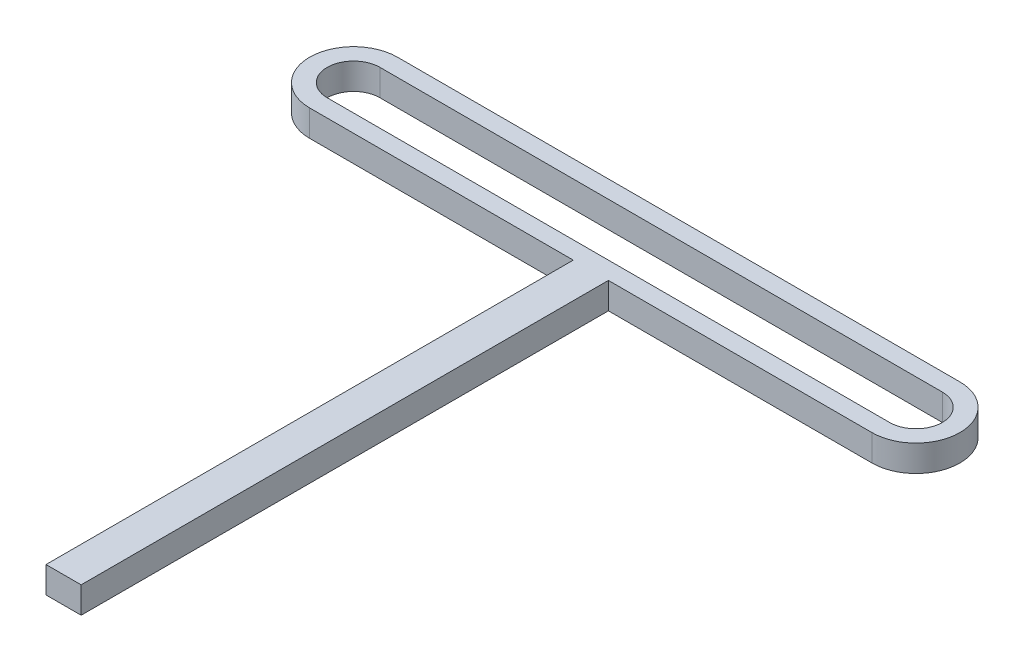
ISO-10303-21;
HEADER;
FILE_DESCRIPTION(('STEP AP214'),'2;1');
FILE_NAME('part.step','',(''),(''),'','','');
FILE_SCHEMA(('AUTOMOTIVE_DESIGN { 1 0 10303 214 1 1 1 1 }'));
ENDSEC;
DATA;
#1=APPLICATION_CONTEXT('core data for automotive mechanical design processes');
#2=APPLICATION_PROTOCOL_DEFINITION('international standard','automotive_design',2000,#1);
#3=PRODUCT_CONTEXT('',#1,'mechanical');
#4=PRODUCT('Part','Part','',(#3));
#5=PRODUCT_RELATED_PRODUCT_CATEGORY('part','',(#4));
#6=PRODUCT_DEFINITION_FORMATION('','',#4);
#7=PRODUCT_DEFINITION_CONTEXT('part definition',#1,'design');
#8=PRODUCT_DEFINITION('design','',#6,#7);
#9=PRODUCT_DEFINITION_SHAPE('','',#8);
#10=(LENGTH_UNIT() NAMED_UNIT(*) SI_UNIT(.MILLI.,.METRE.));
#11=(NAMED_UNIT(*) PLANE_ANGLE_UNIT() SI_UNIT($,.RADIAN.));
#12=(NAMED_UNIT(*) SI_UNIT($,.STERADIAN.) SOLID_ANGLE_UNIT());
#13=UNCERTAINTY_MEASURE_WITH_UNIT(LENGTH_MEASURE(1.E-05),#10,'distance_accuracy_value','');
#14=(GEOMETRIC_REPRESENTATION_CONTEXT(3) GLOBAL_UNCERTAINTY_ASSIGNED_CONTEXT((#13)) GLOBAL_UNIT_ASSIGNED_CONTEXT((#10,
#11,#12)) REPRESENTATION_CONTEXT('',''));
#15=CARTESIAN_POINT('',(0.,0.,0.));
#16=DIRECTION('',(0.,0.,1.));
#17=DIRECTION('',(1.,0.,0.));
#18=AXIS2_PLACEMENT_3D('',#15,#16,#17);
#19=CARTESIAN_POINT('',(0.,3.,5.));
#20=DIRECTION('',(0.,0.,-1.));
#21=DIRECTION('',(-1.,0.,0.));
#22=AXIS2_PLACEMENT_3D('',#19,#20,#21);
#23=PLANE('',#22);
#24=DIRECTION('',(0.,1.,0.));
#25=VECTOR('',#24,1.);
#26=CARTESIAN_POINT('',(2.,3.,5.));
#27=LINE('',#26,#25);
#28=CARTESIAN_POINT('',(2.,0.,5.));
#29=VERTEX_POINT('',#28);
#30=CARTESIAN_POINT('',(2.,3.,5.));
#31=VERTEX_POINT('',#30);
#32=EDGE_CURVE('E12',#29,#31,#27,.T.);
#33=ORIENTED_EDGE('',*,*,#32,.F.);
#34=DIRECTION('',(1.,0.,0.));
#35=VECTOR('',#34,1.);
#36=CARTESIAN_POINT('',(0.,0.,5.));
#37=LINE('',#36,#35);
#38=CARTESIAN_POINT('',(32.,0.,5.));
#39=VERTEX_POINT('',#38);
#40=EDGE_CURVE('E183',#29,#39,#37,.T.);
#41=ORIENTED_EDGE('',*,*,#40,.T.);
#42=DIRECTION('',(0.,-1.,0.));
#43=VECTOR('',#42,1.);
#44=CARTESIAN_POINT('',(32.,3.,5.));
#45=LINE('',#44,#43);
#46=CARTESIAN_POINT('',(32.,3.,5.));
#47=VERTEX_POINT('',#46);
#48=EDGE_CURVE('E168',#47,#39,#45,.T.);
#49=ORIENTED_EDGE('',*,*,#48,.F.);
#50=DIRECTION('',(1.,0.,0.));
#51=VECTOR('',#50,1.);
#52=CARTESIAN_POINT('',(0.,3.,5.));
#53=LINE('',#52,#51);
#54=EDGE_CURVE('E214',#31,#47,#53,.T.);
#55=ORIENTED_EDGE('',*,*,#54,.F.);
#56=EDGE_LOOP('',(#33,#41,#49,#55));
#57=FACE_BOUND('',#56,.T.);
#58=ADVANCED_FACE('F65',(#57),#23,.F.);
#59=CARTESIAN_POINT('',(0.,3.,-4.99999999999999));
#60=DIRECTION('',(0.,0.,-1.));
#61=DIRECTION('',(-1.,0.,0.));
#62=AXIS2_PLACEMENT_3D('',#59,#60,#61);
#63=PLANE('',#62);
#64=DIRECTION('',(1.,0.,0.));
#65=VECTOR('',#64,1.);
#66=CARTESIAN_POINT('',(0.,0.,-4.99999999999999));
#67=LINE('',#66,#65);
#68=CARTESIAN_POINT('',(-32.,0.,-4.99999999999999));
#69=VERTEX_POINT('',#68);
#70=CARTESIAN_POINT('',(32.,0.,-4.99999999999999));
#71=VERTEX_POINT('',#70);
#72=EDGE_CURVE('E188',#69,#71,#67,.T.);
#73=ORIENTED_EDGE('',*,*,#72,.F.);
#74=DIRECTION('',(0.,-1.,0.));
#75=VECTOR('',#74,1.);
#76=CARTESIAN_POINT('',(-32.,3.,-4.99999999999999));
#77=LINE('',#76,#75);
#78=CARTESIAN_POINT('',(-32.,3.,-4.99999999999999));
#79=VERTEX_POINT('',#78);
#80=EDGE_CURVE('E142',#79,#69,#77,.T.);
#81=ORIENTED_EDGE('',*,*,#80,.F.);
#82=DIRECTION('',(1.,0.,0.));
#83=VECTOR('',#82,1.);
#84=CARTESIAN_POINT('',(0.,3.,-4.99999999999999));
#85=LINE('',#84,#83);
#86=CARTESIAN_POINT('',(32.,3.,-4.99999999999999));
#87=VERTEX_POINT('',#86);
#88=EDGE_CURVE('E219',#79,#87,#85,.T.);
#89=ORIENTED_EDGE('',*,*,#88,.T.);
#90=DIRECTION('',(0.,-1.,0.));
#91=VECTOR('',#90,1.);
#92=CARTESIAN_POINT('',(32.,3.,-4.99999999999999));
#93=LINE('',#92,#91);
#94=EDGE_CURVE('E147',#87,#71,#93,.T.);
#95=ORIENTED_EDGE('',*,*,#94,.T.);
#96=EDGE_LOOP('',(#73,#81,#89,#95));
#97=FACE_BOUND('',#96,.T.);
#98=ADVANCED_FACE('F327',(#97),#63,.T.);
#99=CARTESIAN_POINT('',(-32.,3.,0.));
#100=DIRECTION('',(0.,-1.,0.));
#101=DIRECTION('',(0.,0.,-1.));
#102=AXIS2_PLACEMENT_3D('',#99,#100,#101);
#103=CYLINDRICAL_SURFACE('',#102,4.99999999999999);
#104=CARTESIAN_POINT('',(-32.,0.,0.));
#105=DIRECTION('',(0.,1.,0.));
#106=DIRECTION('',(0.,0.,1.));
#107=AXIS2_PLACEMENT_3D('',#104,#105,#106);
#108=CIRCLE('',#107,4.99999999999999);
#109=CARTESIAN_POINT('',(-32.,0.,5.));
#110=VERTEX_POINT('',#109);
#111=EDGE_CURVE('E184',#69,#110,#108,.T.);
#112=ORIENTED_EDGE('',*,*,#111,.T.);
#113=DIRECTION('',(0.,-1.,0.));
#114=VECTOR('',#113,1.);
#115=CARTESIAN_POINT('',(-32.,3.,5.));
#116=LINE('',#115,#114);
#117=CARTESIAN_POINT('',(-32.,3.,5.));
#118=VERTEX_POINT('',#117);
#119=EDGE_CURVE('E164',#118,#110,#116,.T.);
#120=ORIENTED_EDGE('',*,*,#119,.F.);
#121=CARTESIAN_POINT('',(-32.,3.,0.));
#122=DIRECTION('',(0.,1.,0.));
#123=DIRECTION('',(0.,0.,1.));
#124=AXIS2_PLACEMENT_3D('',#121,#122,#123);
#125=CIRCLE('',#124,4.99999999999999);
#126=EDGE_CURVE('E215',#79,#118,#125,.T.);
#127=ORIENTED_EDGE('',*,*,#126,.F.);
#128=ORIENTED_EDGE('',*,*,#80,.T.);
#129=EDGE_LOOP('',(#112,#120,#127,#128));
#130=FACE_BOUND('',#129,.T.);
#131=ADVANCED_FACE('F333',(#130),#103,.T.);
#132=CARTESIAN_POINT('',(-2.,0.,5.));
#133=VERTEX_POINT('',#132);
#134=EDGE_CURVE('E180',#110,#133,#37,.T.);
#135=ORIENTED_EDGE('',*,*,#134,.T.);
#136=DIRECTION('',(0.,1.,0.));
#137=VECTOR('',#136,1.);
#138=CARTESIAN_POINT('',(-2.,3.,5.));
#139=LINE('',#138,#137);
#140=CARTESIAN_POINT('',(-2.,3.,5.));
#141=VERTEX_POINT('',#140);
#142=EDGE_CURVE('E76',#133,#141,#139,.T.);
#143=ORIENTED_EDGE('',*,*,#142,.T.);
#144=EDGE_CURVE('E210',#118,#141,#53,.T.);
#145=ORIENTED_EDGE('',*,*,#144,.F.);
#146=ORIENTED_EDGE('',*,*,#119,.T.);
#147=EDGE_LOOP('',(#135,#143,#145,#146));
#148=FACE_BOUND('',#147,.T.);
#149=ADVANCED_FACE('F329',(#148),#23,.F.);
#150=CARTESIAN_POINT('',(32.,3.,0.));
#151=DIRECTION('',(0.,-1.,0.));
#152=DIRECTION('',(0.,0.,-1.));
#153=AXIS2_PLACEMENT_3D('',#150,#151,#152);
#154=CYLINDRICAL_SURFACE('',#153,2.99999999999999);
#155=CARTESIAN_POINT('',(32.,0.,0.));
#156=DIRECTION('',(0.,1.,0.));
#157=DIRECTION('',(0.,0.,1.));
#158=AXIS2_PLACEMENT_3D('',#155,#156,#157);
#159=CIRCLE('',#158,2.99999999999999);
#160=CARTESIAN_POINT('',(32.,0.,2.99999999999998));
#161=VERTEX_POINT('',#160);
#162=CARTESIAN_POINT('',(32.,0.,-3.));
#163=VERTEX_POINT('',#162);
#164=EDGE_CURVE('E203',#161,#163,#159,.T.);
#165=ORIENTED_EDGE('',*,*,#164,.F.);
#166=DIRECTION('',(0.,-1.,0.));
#167=VECTOR('',#166,1.);
#168=CARTESIAN_POINT('',(32.,3.,2.99999999999998));
#169=LINE('',#168,#167);
#170=CARTESIAN_POINT('',(32.,3.,2.99999999999998));
#171=VERTEX_POINT('',#170);
#172=EDGE_CURVE('E143',#171,#161,#169,.T.);
#173=ORIENTED_EDGE('',*,*,#172,.F.);
#174=CARTESIAN_POINT('',(32.,3.,0.));
#175=DIRECTION('',(0.,1.,0.));
#176=DIRECTION('',(0.,0.,1.));
#177=AXIS2_PLACEMENT_3D('',#174,#175,#176);
#178=CIRCLE('',#177,2.99999999999999);
#179=CARTESIAN_POINT('',(32.,3.,-3.));
#180=VERTEX_POINT('',#179);
#181=EDGE_CURVE('E179',#171,#180,#178,.T.);
#182=ORIENTED_EDGE('',*,*,#181,.T.);
#183=DIRECTION('',(0.,-1.,0.));
#184=VECTOR('',#183,1.);
#185=CARTESIAN_POINT('',(32.,3.,-3.));
#186=LINE('',#185,#184);
#187=EDGE_CURVE('E156',#180,#163,#186,.T.);
#188=ORIENTED_EDGE('',*,*,#187,.T.);
#189=EDGE_LOOP('',(#165,#173,#182,#188));
#190=FACE_BOUND('',#189,.T.);
#191=ADVANCED_FACE('F242',(#190),#154,.F.);
#192=CARTESIAN_POINT('',(0.,3.,2.99999999999998));
#193=DIRECTION('',(0.,0.,-1.));
#194=DIRECTION('',(-1.,0.,0.));
#195=AXIS2_PLACEMENT_3D('',#192,#193,#194);
#196=PLANE('',#195);
#197=DIRECTION('',(1.,0.,0.));
#198=VECTOR('',#197,1.);
#199=CARTESIAN_POINT('',(0.,0.,2.99999999999998));
#200=LINE('',#199,#198);
#201=CARTESIAN_POINT('',(-32.,0.,2.99999999999999));
#202=VERTEX_POINT('',#201);
#203=EDGE_CURVE('E199',#202,#161,#200,.T.);
#204=ORIENTED_EDGE('',*,*,#203,.F.);
#205=DIRECTION('',(0.,-1.,0.));
#206=VECTOR('',#205,1.);
#207=CARTESIAN_POINT('',(-32.,3.,2.99999999999999));
#208=LINE('',#207,#206);
#209=CARTESIAN_POINT('',(-32.,3.,2.99999999999999));
#210=VERTEX_POINT('',#209);
#211=EDGE_CURVE('E148',#210,#202,#208,.T.);
#212=ORIENTED_EDGE('',*,*,#211,.F.);
#213=DIRECTION('',(1.,0.,0.));
#214=VECTOR('',#213,1.);
#215=CARTESIAN_POINT('',(0.,3.,2.99999999999998));
#216=LINE('',#215,#214);
#217=EDGE_CURVE('E231',#210,#171,#216,.T.);
#218=ORIENTED_EDGE('',*,*,#217,.T.);
#219=ORIENTED_EDGE('',*,*,#172,.T.);
#220=EDGE_LOOP('',(#204,#212,#218,#219));
#221=FACE_BOUND('',#220,.T.);
#222=ADVANCED_FACE('F261',(#221),#196,.T.);
#223=CARTESIAN_POINT('',(-32.,3.,0.));
#224=DIRECTION('',(0.,-1.,0.));
#225=DIRECTION('',(0.,0.,-1.));
#226=AXIS2_PLACEMENT_3D('',#223,#224,#225);
#227=CYLINDRICAL_SURFACE('',#226,2.99999999999999);
#228=CARTESIAN_POINT('',(-32.,0.,0.));
#229=DIRECTION('',(0.,1.,0.));
#230=DIRECTION('',(0.,0.,1.));
#231=AXIS2_PLACEMENT_3D('',#228,#229,#230);
#232=CIRCLE('',#231,2.99999999999999);
#233=CARTESIAN_POINT('',(-32.,0.,-2.99999999999999));
#234=VERTEX_POINT('',#233);
#235=EDGE_CURVE('E195',#234,#202,#232,.T.);
#236=ORIENTED_EDGE('',*,*,#235,.F.);
#237=DIRECTION('',(0.,-1.,0.));
#238=VECTOR('',#237,1.);
#239=CARTESIAN_POINT('',(-32.,3.,-2.99999999999999));
#240=LINE('',#239,#238);
#241=CARTESIAN_POINT('',(-32.,3.,-2.99999999999999));
#242=VERTEX_POINT('',#241);
#243=EDGE_CURVE('E152',#242,#234,#240,.T.);
#244=ORIENTED_EDGE('',*,*,#243,.F.);
#245=CARTESIAN_POINT('',(-32.,3.,0.));
#246=DIRECTION('',(0.,1.,0.));
#247=DIRECTION('',(0.,0.,1.));
#248=AXIS2_PLACEMENT_3D('',#245,#246,#247);
#249=CIRCLE('',#248,2.99999999999999);
#250=EDGE_CURVE('E227',#242,#210,#249,.T.);
#251=ORIENTED_EDGE('',*,*,#250,.T.);
#252=ORIENTED_EDGE('',*,*,#211,.T.);
#253=EDGE_LOOP('',(#236,#244,#251,#252));
#254=FACE_BOUND('',#253,.T.);
#255=ADVANCED_FACE('F266',(#254),#227,.F.);
#256=CARTESIAN_POINT('',(0.,3.,-2.99999999999999));
#257=DIRECTION('',(0.,0.,-1.));
#258=DIRECTION('',(-1.,0.,0.));
#259=AXIS2_PLACEMENT_3D('',#256,#257,#258);
#260=PLANE('',#259);
#261=DIRECTION('',(1.,0.,0.));
#262=VECTOR('',#261,1.);
#263=CARTESIAN_POINT('',(0.,0.,-2.99999999999999));
#264=LINE('',#263,#262);
#265=EDGE_CURVE('E191',#234,#163,#264,.T.);
#266=ORIENTED_EDGE('',*,*,#265,.T.);
#267=ORIENTED_EDGE('',*,*,#187,.F.);
#268=DIRECTION('',(1.,0.,0.));
#269=VECTOR('',#268,1.);
#270=CARTESIAN_POINT('',(0.,3.,-2.99999999999999));
#271=LINE('',#270,#269);
#272=EDGE_CURVE('E223',#242,#180,#271,.T.);
#273=ORIENTED_EDGE('',*,*,#272,.F.);
#274=ORIENTED_EDGE('',*,*,#243,.T.);
#275=EDGE_LOOP('',(#266,#267,#273,#274));
#276=FACE_BOUND('',#275,.T.);
#277=ADVANCED_FACE('F308',(#276),#260,.F.);
#278=CARTESIAN_POINT('',(32.,3.,0.));
#279=DIRECTION('',(0.,-1.,0.));
#280=DIRECTION('',(0.,0.,-1.));
#281=AXIS2_PLACEMENT_3D('',#278,#279,#280);
#282=CYLINDRICAL_SURFACE('',#281,4.99999999999999);
#283=CARTESIAN_POINT('',(32.,0.,0.));
#284=DIRECTION('',(0.,1.,0.));
#285=DIRECTION('',(0.,0.,1.));
#286=AXIS2_PLACEMENT_3D('',#283,#284,#285);
#287=CIRCLE('',#286,4.99999999999999);
#288=EDGE_CURVE('E175',#39,#71,#287,.T.);
#289=ORIENTED_EDGE('',*,*,#288,.T.);
#290=ORIENTED_EDGE('',*,*,#94,.F.);
#291=CARTESIAN_POINT('',(32.,3.,0.));
#292=DIRECTION('',(0.,1.,0.));
#293=DIRECTION('',(0.,0.,1.));
#294=AXIS2_PLACEMENT_3D('',#291,#292,#293);
#295=CIRCLE('',#294,4.99999999999999);
#296=EDGE_CURVE('E160',#47,#87,#295,.T.);
#297=ORIENTED_EDGE('',*,*,#296,.F.);
#298=ORIENTED_EDGE('',*,*,#48,.T.);
#299=EDGE_LOOP('',(#289,#290,#297,#298));
#300=FACE_BOUND('',#299,.T.);
#301=ADVANCED_FACE('F297',(#300),#282,.T.);
#302=CARTESIAN_POINT('',(0.,3.,0.));
#303=DIRECTION('',(0.,1.,0.));
#304=DIRECTION('',(0.,0.,1.));
#305=AXIS2_PLACEMENT_3D('',#302,#303,#304);
#306=PLANE('',#305);
#307=ORIENTED_EDGE('',*,*,#181,.F.);
#308=ORIENTED_EDGE('',*,*,#217,.F.);
#309=ORIENTED_EDGE('',*,*,#250,.F.);
#310=ORIENTED_EDGE('',*,*,#272,.T.);
#311=EDGE_LOOP('',(#307,#308,#309,#310));
#312=FACE_BOUND('',#311,.T.);
#313=ORIENTED_EDGE('',*,*,#88,.F.);
#314=ORIENTED_EDGE('',*,*,#126,.T.);
#315=ORIENTED_EDGE('',*,*,#144,.T.);
#316=DIRECTION('',(0.,0.,-1.));
#317=VECTOR('',#316,1.);
#318=CARTESIAN_POINT('',(-1.99999999999999,3.,65.));
#319=LINE('',#318,#317);
#320=CARTESIAN_POINT('',(-1.99999999999999,3.,65.));
#321=VERTEX_POINT('',#320);
#322=EDGE_CURVE('E116',#321,#141,#319,.T.);
#323=ORIENTED_EDGE('',*,*,#322,.F.);
#324=DIRECTION('',(1.,0.,0.));
#325=VECTOR('',#324,1.);
#326=CARTESIAN_POINT('',(-1.99999999999999,3.,65.));
#327=LINE('',#326,#325);
#328=CARTESIAN_POINT('',(2.00000000000001,3.,65.));
#329=VERTEX_POINT('',#328);
#330=EDGE_CURVE('E110',#321,#329,#327,.T.);
#331=ORIENTED_EDGE('',*,*,#330,.T.);
#332=DIRECTION('',(0.,0.,-1.));
#333=VECTOR('',#332,1.);
#334=CARTESIAN_POINT('',(2.00000000000001,3.,65.));
#335=LINE('',#334,#333);
#336=EDGE_CURVE('E132',#329,#31,#335,.T.);
#337=ORIENTED_EDGE('',*,*,#336,.T.);
#338=ORIENTED_EDGE('',*,*,#54,.T.);
#339=ORIENTED_EDGE('',*,*,#296,.T.);
#340=EDGE_LOOP('',(#313,#314,#315,#323,#331,#337,#338,#339));
#341=FACE_BOUND('',#340,.T.);
#342=ADVANCED_FACE('F251',(#312,#341),#306,.T.);
#343=CARTESIAN_POINT('',(0.,0.,0.));
#344=DIRECTION('',(0.,1.,0.));
#345=DIRECTION('',(0.,0.,1.));
#346=AXIS2_PLACEMENT_3D('',#343,#344,#345);
#347=PLANE('',#346);
#348=ORIENTED_EDGE('',*,*,#164,.T.);
#349=ORIENTED_EDGE('',*,*,#265,.F.);
#350=ORIENTED_EDGE('',*,*,#235,.T.);
#351=ORIENTED_EDGE('',*,*,#203,.T.);
#352=EDGE_LOOP('',(#348,#349,#350,#351));
#353=FACE_BOUND('',#352,.T.);
#354=ORIENTED_EDGE('',*,*,#72,.T.);
#355=ORIENTED_EDGE('',*,*,#288,.F.);
#356=ORIENTED_EDGE('',*,*,#40,.F.);
#357=DIRECTION('',(0.,0.,-1.));
#358=VECTOR('',#357,1.);
#359=CARTESIAN_POINT('',(2.00000000000001,0.,65.));
#360=LINE('',#359,#358);
#361=CARTESIAN_POINT('',(2.00000000000001,0.,65.));
#362=VERTEX_POINT('',#361);
#363=EDGE_CURVE('E100',#362,#29,#360,.T.);
#364=ORIENTED_EDGE('',*,*,#363,.F.);
#365=DIRECTION('',(1.,0.,0.));
#366=VECTOR('',#365,1.);
#367=CARTESIAN_POINT('',(-1.99999999999999,0.,65.));
#368=LINE('',#367,#366);
#369=CARTESIAN_POINT('',(-1.99999999999999,0.,65.));
#370=VERTEX_POINT('',#369);
#371=EDGE_CURVE('E108',#370,#362,#368,.T.);
#372=ORIENTED_EDGE('',*,*,#371,.F.);
#373=DIRECTION('',(0.,0.,-1.));
#374=VECTOR('',#373,1.);
#375=CARTESIAN_POINT('',(-1.99999999999999,0.,65.));
#376=LINE('',#375,#374);
#377=EDGE_CURVE('E122',#370,#133,#376,.T.);
#378=ORIENTED_EDGE('',*,*,#377,.T.);
#379=ORIENTED_EDGE('',*,*,#134,.F.);
#380=ORIENTED_EDGE('',*,*,#111,.F.);
#381=EDGE_LOOP('',(#354,#355,#356,#364,#372,#378,#379,#380));
#382=FACE_BOUND('',#381,.T.);
#383=ADVANCED_FACE('F119',(#353,#382),#347,.F.);
#384=CARTESIAN_POINT('',(2.00000000000001,3.,65.));
#385=DIRECTION('',(-1.,0.,0.));
#386=DIRECTION('',(0.,0.,1.));
#387=AXIS2_PLACEMENT_3D('',#384,#385,#386);
#388=PLANE('',#387);
#389=ORIENTED_EDGE('',*,*,#363,.T.);
#390=ORIENTED_EDGE('',*,*,#32,.T.);
#391=ORIENTED_EDGE('',*,*,#336,.F.);
#392=DIRECTION('',(0.,-1.,0.));
#393=VECTOR('',#392,1.);
#394=CARTESIAN_POINT('',(2.00000000000001,3.,65.));
#395=LINE('',#394,#393);
#396=EDGE_CURVE('E69',#329,#362,#395,.T.);
#397=ORIENTED_EDGE('',*,*,#396,.T.);
#398=EDGE_LOOP('',(#389,#390,#391,#397));
#399=FACE_BOUND('',#398,.T.);
#400=ADVANCED_FACE('F289',(#399),#388,.F.);
#401=CARTESIAN_POINT('',(-1.99999999999999,3.,65.));
#402=DIRECTION('',(-1.,0.,0.));
#403=DIRECTION('',(0.,0.,1.));
#404=AXIS2_PLACEMENT_3D('',#401,#402,#403);
#405=PLANE('',#404);
#406=ORIENTED_EDGE('',*,*,#377,.F.);
#407=DIRECTION('',(0.,-1.,0.));
#408=VECTOR('',#407,1.);
#409=CARTESIAN_POINT('',(-1.99999999999999,3.,65.));
#410=LINE('',#409,#408);
#411=EDGE_CURVE('E106',#321,#370,#410,.T.);
#412=ORIENTED_EDGE('',*,*,#411,.F.);
#413=ORIENTED_EDGE('',*,*,#322,.T.);
#414=ORIENTED_EDGE('',*,*,#142,.F.);
#415=EDGE_LOOP('',(#406,#412,#413,#414));
#416=FACE_BOUND('',#415,.T.);
#417=ADVANCED_FACE('F127',(#416),#405,.T.);
#418=CARTESIAN_POINT('',(-1.99999999999999,3.,65.));
#419=DIRECTION('',(0.,0.,-1.));
#420=DIRECTION('',(-1.,0.,0.));
#421=AXIS2_PLACEMENT_3D('',#418,#419,#420);
#422=PLANE('',#421);
#423=ORIENTED_EDGE('',*,*,#371,.T.);
#424=ORIENTED_EDGE('',*,*,#396,.F.);
#425=ORIENTED_EDGE('',*,*,#330,.F.);
#426=ORIENTED_EDGE('',*,*,#411,.T.);
#427=EDGE_LOOP('',(#423,#424,#425,#426));
#428=FACE_BOUND('',#427,.T.);
#429=ADVANCED_FACE('F67',(#428),#422,.F.);
#430=CLOSED_SHELL('',(#58,#98,#131,#149,#191,#222,#255,#277,#301,#342,#383,#400,#417,#429));
#431=MANIFOLD_SOLID_BREP('B2',#430);
#432=ADVANCED_BREP_SHAPE_REPRESENTATION('',(#18,#431),#14);
#433=SHAPE_DEFINITION_REPRESENTATION(#9,#432);
ENDSEC;
END-ISO-10303-21;
